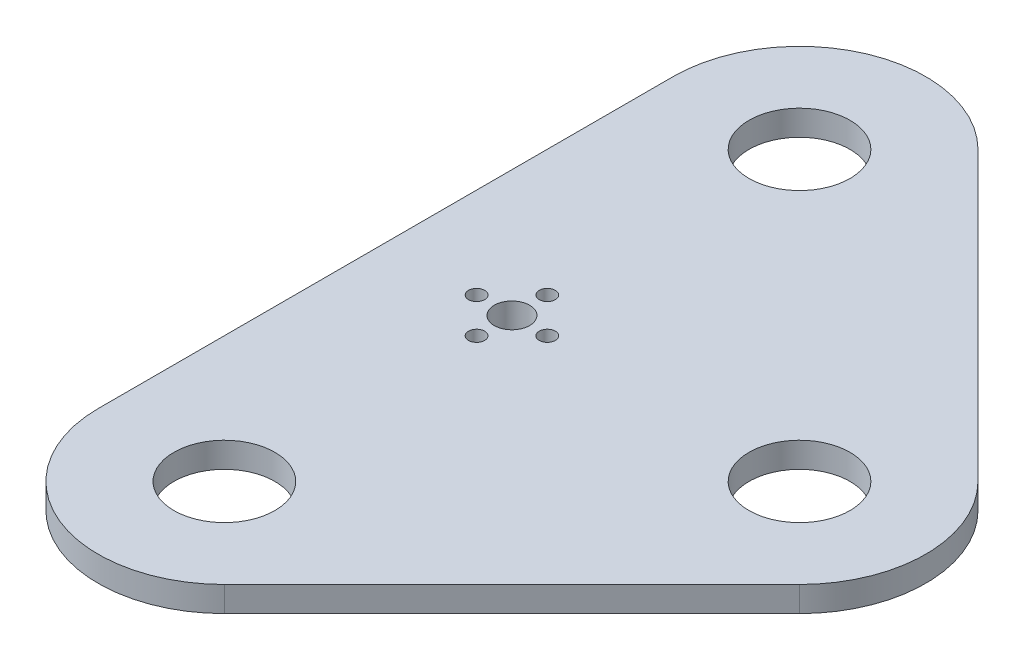
ISO-10303-21;
HEADER;
FILE_DESCRIPTION(('STEP AP214'),'2;1');
FILE_NAME('part.step','',(''),(''),'','','');
FILE_SCHEMA(('AUTOMOTIVE_DESIGN { 1 0 10303 214 1 1 1 1 }'));
ENDSEC;
DATA;
#1=APPLICATION_CONTEXT('core data for automotive mechanical design processes');
#2=APPLICATION_PROTOCOL_DEFINITION('international standard','automotive_design',2000,#1);
#3=PRODUCT_CONTEXT('',#1,'mechanical');
#4=PRODUCT('Part','Part','',(#3));
#5=PRODUCT_RELATED_PRODUCT_CATEGORY('part','',(#4));
#6=PRODUCT_DEFINITION_FORMATION('','',#4);
#7=PRODUCT_DEFINITION_CONTEXT('part definition',#1,'design');
#8=PRODUCT_DEFINITION('design','',#6,#7);
#9=PRODUCT_DEFINITION_SHAPE('','',#8);
#10=(LENGTH_UNIT() NAMED_UNIT(*) SI_UNIT(.MILLI.,.METRE.));
#11=(NAMED_UNIT(*) PLANE_ANGLE_UNIT() SI_UNIT($,.RADIAN.));
#12=(NAMED_UNIT(*) SI_UNIT($,.STERADIAN.) SOLID_ANGLE_UNIT());
#13=UNCERTAINTY_MEASURE_WITH_UNIT(LENGTH_MEASURE(1.E-05),#10,'distance_accuracy_value','');
#14=(GEOMETRIC_REPRESENTATION_CONTEXT(3) GLOBAL_UNCERTAINTY_ASSIGNED_CONTEXT((#13)) GLOBAL_UNIT_ASSIGNED_CONTEXT((#10,
#11,#12)) REPRESENTATION_CONTEXT('',''));
#15=CARTESIAN_POINT('',(0.,0.,0.));
#16=DIRECTION('',(0.,0.,1.));
#17=DIRECTION('',(1.,0.,0.));
#18=AXIS2_PLACEMENT_3D('',#15,#16,#17);
#19=CARTESIAN_POINT('',(-25.,5.,0.));
#20=DIRECTION('',(1.,0.,0.));
#21=DIRECTION('',(0.,0.,-1.));
#22=AXIS2_PLACEMENT_3D('',#19,#20,#21);
#23=PLANE('',#22);
#24=DIRECTION('',(0.,0.,1.));
#25=VECTOR('',#24,1.);
#26=CARTESIAN_POINT('',(-25.,0.,0.));
#27=LINE('',#26,#25);
#28=CARTESIAN_POINT('',(-25.,0.,-56.96));
#29=VERTEX_POINT('',#28);
#30=CARTESIAN_POINT('',(-25.,0.,56.96));
#31=VERTEX_POINT('',#30);
#32=EDGE_CURVE('E151',#29,#31,#27,.T.);
#33=ORIENTED_EDGE('',*,*,#32,.T.);
#34=DIRECTION('',(0.,-1.,0.));
#35=VECTOR('',#34,1.);
#36=CARTESIAN_POINT('',(-25.,5.,56.96));
#37=LINE('',#36,#35);
#38=CARTESIAN_POINT('',(-25.,5.,56.96));
#39=VERTEX_POINT('',#38);
#40=EDGE_CURVE('E11',#39,#31,#37,.T.);
#41=ORIENTED_EDGE('',*,*,#40,.F.);
#42=DIRECTION('',(0.,0.,1.));
#43=VECTOR('',#42,1.);
#44=CARTESIAN_POINT('',(-25.,5.,0.));
#45=LINE('',#44,#43);
#46=CARTESIAN_POINT('',(-25.,5.,-56.96));
#47=VERTEX_POINT('',#46);
#48=EDGE_CURVE('E90',#47,#39,#45,.T.);
#49=ORIENTED_EDGE('',*,*,#48,.F.);
#50=DIRECTION('',(0.,-1.,0.));
#51=VECTOR('',#50,1.);
#52=CARTESIAN_POINT('',(-25.,5.,-56.96));
#53=LINE('',#52,#51);
#54=EDGE_CURVE('E135',#47,#29,#53,.T.);
#55=ORIENTED_EDGE('',*,*,#54,.T.);
#56=EDGE_LOOP('',(#33,#41,#49,#55));
#57=FACE_BOUND('',#56,.T.);
#58=ADVANCED_FACE('F43',(#57),#23,.F.);
#59=CARTESIAN_POINT('',(0.,5.,56.96));
#60=DIRECTION('',(0.,-1.,0.));
#61=DIRECTION('',(0.,0.,-1.));
#62=AXIS2_PLACEMENT_3D('',#59,#60,#61);
#63=CYLINDRICAL_SURFACE('',#62,25.);
#64=CARTESIAN_POINT('',(0.,0.,56.96));
#65=DIRECTION('',(0.,1.,0.));
#66=DIRECTION('',(0.,0.,1.));
#67=AXIS2_PLACEMENT_3D('',#64,#65,#66);
#68=CIRCLE('',#67,25.);
#69=CARTESIAN_POINT('',(17.6776695296637,0.,74.6376695296637));
#70=VERTEX_POINT('',#69);
#71=EDGE_CURVE('E154',#70,#31,#68,.F.);
#72=ORIENTED_EDGE('',*,*,#71,.F.);
#73=DIRECTION('',(0.,-1.,0.));
#74=VECTOR('',#73,1.);
#75=CARTESIAN_POINT('',(17.6776695296637,5.,74.6376695296637));
#76=LINE('',#75,#74);
#77=CARTESIAN_POINT('',(17.6776695296637,5.,74.6376695296637));
#78=VERTEX_POINT('',#77);
#79=EDGE_CURVE('E52',#78,#70,#76,.T.);
#80=ORIENTED_EDGE('',*,*,#79,.F.);
#81=CARTESIAN_POINT('',(0.,5.,56.96));
#82=DIRECTION('',(0.,1.,0.));
#83=DIRECTION('',(0.,0.,1.));
#84=AXIS2_PLACEMENT_3D('',#81,#82,#83);
#85=CIRCLE('',#84,25.);
#86=EDGE_CURVE('E186',#78,#39,#85,.F.);
#87=ORIENTED_EDGE('',*,*,#86,.T.);
#88=ORIENTED_EDGE('',*,*,#40,.T.);
#89=EDGE_LOOP('',(#72,#80,#87,#88));
#90=FACE_BOUND('',#89,.T.);
#91=ADVANCED_FACE('F185',(#90),#63,.T.);
#92=CARTESIAN_POINT('',(46.1576695296637,5.,46.1576695296637));
#93=DIRECTION('',(-0.707106781186548,0.,-0.707106781186548));
#94=DIRECTION('',(-0.707106781186548,0.,0.707106781186548));
#95=AXIS2_PLACEMENT_3D('',#92,#93,#94);
#96=PLANE('',#95);
#97=DIRECTION('',(0.707106781186548,0.,-0.707106781186548));
#98=VECTOR('',#97,1.);
#99=CARTESIAN_POINT('',(46.1576695296637,0.,46.1576695296637));
#100=LINE('',#99,#98);
#101=CARTESIAN_POINT('',(74.6376695296637,0.,17.6776695296637));
#102=VERTEX_POINT('',#101);
#103=EDGE_CURVE('E157',#70,#102,#100,.T.);
#104=ORIENTED_EDGE('',*,*,#103,.T.);
#105=DIRECTION('',(0.,-1.,0.));
#106=VECTOR('',#105,1.);
#107=CARTESIAN_POINT('',(74.6376695296637,5.,17.6776695296637));
#108=LINE('',#107,#106);
#109=CARTESIAN_POINT('',(74.6376695296637,5.,17.6776695296637));
#110=VERTEX_POINT('',#109);
#111=EDGE_CURVE('E119',#110,#102,#108,.T.);
#112=ORIENTED_EDGE('',*,*,#111,.F.);
#113=DIRECTION('',(0.707106781186548,0.,-0.707106781186548));
#114=VECTOR('',#113,1.);
#115=CARTESIAN_POINT('',(46.1576695296637,5.,46.1576695296637));
#116=LINE('',#115,#114);
#117=EDGE_CURVE('E106',#78,#110,#116,.T.);
#118=ORIENTED_EDGE('',*,*,#117,.F.);
#119=ORIENTED_EDGE('',*,*,#79,.T.);
#120=EDGE_LOOP('',(#104,#112,#118,#119));
#121=FACE_BOUND('',#120,.T.);
#122=ADVANCED_FACE('F177',(#121),#96,.F.);
#123=CARTESIAN_POINT('',(56.96,5.,0.));
#124=DIRECTION('',(0.,-1.,0.));
#125=DIRECTION('',(0.,0.,-1.));
#126=AXIS2_PLACEMENT_3D('',#123,#124,#125);
#127=CYLINDRICAL_SURFACE('',#126,25.);
#128=CARTESIAN_POINT('',(56.96,0.,0.));
#129=DIRECTION('',(0.,1.,0.));
#130=DIRECTION('',(0.,0.,1.));
#131=AXIS2_PLACEMENT_3D('',#128,#129,#130);
#132=CIRCLE('',#131,25.);
#133=CARTESIAN_POINT('',(74.6376695296637,0.,-17.6776695296637));
#134=VERTEX_POINT('',#133);
#135=EDGE_CURVE('E115',#102,#134,#132,.T.);
#136=ORIENTED_EDGE('',*,*,#135,.T.);
#137=DIRECTION('',(0.,-1.,0.));
#138=VECTOR('',#137,1.);
#139=CARTESIAN_POINT('',(74.6376695296637,5.,-17.6776695296637));
#140=LINE('',#139,#138);
#141=CARTESIAN_POINT('',(74.6376695296637,5.,-17.6776695296637));
#142=VERTEX_POINT('',#141);
#143=EDGE_CURVE('E112',#142,#134,#140,.T.);
#144=ORIENTED_EDGE('',*,*,#143,.F.);
#145=CARTESIAN_POINT('',(56.96,5.,0.));
#146=DIRECTION('',(0.,1.,0.));
#147=DIRECTION('',(0.,0.,1.));
#148=AXIS2_PLACEMENT_3D('',#145,#146,#147);
#149=CIRCLE('',#148,25.);
#150=EDGE_CURVE('E99',#110,#142,#149,.T.);
#151=ORIENTED_EDGE('',*,*,#150,.F.);
#152=ORIENTED_EDGE('',*,*,#111,.T.);
#153=EDGE_LOOP('',(#136,#144,#151,#152));
#154=FACE_BOUND('',#153,.T.);
#155=ADVANCED_FACE('F113',(#154),#127,.T.);
#156=CARTESIAN_POINT('',(46.1576695296637,5.,-46.1576695296636));
#157=DIRECTION('',(0.707106781186548,0.,-0.707106781186547));
#158=DIRECTION('',(-0.707106781186547,0.,-0.707106781186548));
#159=AXIS2_PLACEMENT_3D('',#156,#157,#158);
#160=PLANE('',#159);
#161=DIRECTION('',(0.707106781186547,0.,0.707106781186548));
#162=VECTOR('',#161,1.);
#163=CARTESIAN_POINT('',(46.1576695296637,0.,-46.1576695296636));
#164=LINE('',#163,#162);
#165=CARTESIAN_POINT('',(17.6776695296637,0.,-74.6376695296637));
#166=VERTEX_POINT('',#165);
#167=EDGE_CURVE('E160',#166,#134,#164,.T.);
#168=ORIENTED_EDGE('',*,*,#167,.F.);
#169=DIRECTION('',(0.,-1.,0.));
#170=VECTOR('',#169,1.);
#171=CARTESIAN_POINT('',(17.6776695296637,5.,-74.6376695296637));
#172=LINE('',#171,#170);
#173=CARTESIAN_POINT('',(17.6776695296637,5.,-74.6376695296637));
#174=VERTEX_POINT('',#173);
#175=EDGE_CURVE('E81',#174,#166,#172,.T.);
#176=ORIENTED_EDGE('',*,*,#175,.F.);
#177=DIRECTION('',(0.707106781186547,0.,0.707106781186548));
#178=VECTOR('',#177,1.);
#179=CARTESIAN_POINT('',(46.1576695296637,5.,-46.1576695296636));
#180=LINE('',#179,#178);
#181=EDGE_CURVE('E104',#174,#142,#180,.T.);
#182=ORIENTED_EDGE('',*,*,#181,.T.);
#183=ORIENTED_EDGE('',*,*,#143,.T.);
#184=EDGE_LOOP('',(#168,#176,#182,#183));
#185=FACE_BOUND('',#184,.T.);
#186=ADVANCED_FACE('F121',(#185),#160,.T.);
#187=CARTESIAN_POINT('',(56.96,5.,0.));
#188=DIRECTION('',(0.,-1.,0.));
#189=DIRECTION('',(0.,0.,-1.));
#190=AXIS2_PLACEMENT_3D('',#187,#188,#189);
#191=CYLINDRICAL_SURFACE('',#190,10.);
#192=CARTESIAN_POINT('',(56.96,5.,0.));
#193=DIRECTION('',(0.,1.,0.));
#194=DIRECTION('',(0.,0.,1.));
#195=AXIS2_PLACEMENT_3D('',#192,#193,#194);
#196=CIRCLE('',#195,10.);
#197=CARTESIAN_POINT('',(56.96,5.,10.));
#198=VERTEX_POINT('',#197);
#199=EDGE_CURVE('E129',#198,#198,#196,.T.);
#200=ORIENTED_EDGE('',*,*,#199,.T.);
#201=EDGE_LOOP('',(#200));
#202=FACE_BOUND('',#201,.T.);
#203=CARTESIAN_POINT('',(56.96,0.,0.));
#204=DIRECTION('',(0.,1.,0.));
#205=DIRECTION('',(0.,0.,1.));
#206=AXIS2_PLACEMENT_3D('',#203,#204,#205);
#207=CIRCLE('',#206,10.);
#208=CARTESIAN_POINT('',(56.96,0.,10.));
#209=VERTEX_POINT('',#208);
#210=EDGE_CURVE('E166',#209,#209,#207,.T.);
#211=ORIENTED_EDGE('',*,*,#210,.F.);
#212=EDGE_LOOP('',(#211));
#213=FACE_BOUND('',#212,.T.);
#214=ADVANCED_FACE('F200',(#202,#213),#191,.F.);
#215=CARTESIAN_POINT('',(0.,5.,-56.96));
#216=DIRECTION('',(0.,-1.,0.));
#217=DIRECTION('',(0.,0.,-1.));
#218=AXIS2_PLACEMENT_3D('',#215,#216,#217);
#219=CYLINDRICAL_SURFACE('',#218,10.);
#220=CARTESIAN_POINT('',(0.,5.,-56.96));
#221=DIRECTION('',(0.,1.,0.));
#222=DIRECTION('',(0.,0.,1.));
#223=AXIS2_PLACEMENT_3D('',#220,#221,#222);
#224=CIRCLE('',#223,10.);
#225=CARTESIAN_POINT('',(0.,5.,-46.96));
#226=VERTEX_POINT('',#225);
#227=EDGE_CURVE('E123',#226,#226,#224,.T.);
#228=ORIENTED_EDGE('',*,*,#227,.T.);
#229=EDGE_LOOP('',(#228));
#230=FACE_BOUND('',#229,.T.);
#231=CARTESIAN_POINT('',(0.,0.,-56.96));
#232=DIRECTION('',(0.,1.,0.));
#233=DIRECTION('',(0.,0.,1.));
#234=AXIS2_PLACEMENT_3D('',#231,#232,#233);
#235=CIRCLE('',#234,10.);
#236=CARTESIAN_POINT('',(0.,0.,-46.96));
#237=VERTEX_POINT('',#236);
#238=EDGE_CURVE('E163',#237,#237,#235,.T.);
#239=ORIENTED_EDGE('',*,*,#238,.F.);
#240=EDGE_LOOP('',(#239));
#241=FACE_BOUND('',#240,.T.);
#242=ADVANCED_FACE('F191',(#230,#241),#219,.F.);
#243=CARTESIAN_POINT('',(0.,5.,-56.96));
#244=DIRECTION('',(0.,-1.,0.));
#245=DIRECTION('',(0.,0.,-1.));
#246=AXIS2_PLACEMENT_3D('',#243,#244,#245);
#247=CYLINDRICAL_SURFACE('',#246,25.);
#248=CARTESIAN_POINT('',(0.,0.,-56.96));
#249=DIRECTION('',(0.,1.,0.));
#250=DIRECTION('',(0.,0.,1.));
#251=AXIS2_PLACEMENT_3D('',#248,#249,#250);
#252=CIRCLE('',#251,25.);
#253=EDGE_CURVE('E84',#166,#29,#252,.T.);
#254=ORIENTED_EDGE('',*,*,#253,.T.);
#255=ORIENTED_EDGE('',*,*,#54,.F.);
#256=CARTESIAN_POINT('',(0.,5.,-56.96));
#257=DIRECTION('',(0.,1.,0.));
#258=DIRECTION('',(0.,0.,1.));
#259=AXIS2_PLACEMENT_3D('',#256,#257,#258);
#260=CIRCLE('',#259,25.);
#261=EDGE_CURVE('E60',#174,#47,#260,.T.);
#262=ORIENTED_EDGE('',*,*,#261,.F.);
#263=ORIENTED_EDGE('',*,*,#175,.T.);
#264=EDGE_LOOP('',(#254,#255,#262,#263));
#265=FACE_BOUND('',#264,.T.);
#266=ADVANCED_FACE('F188',(#265),#247,.T.);
#267=CARTESIAN_POINT('',(0.,5.,7.));
#268=DIRECTION('',(0.,-1.,0.));
#269=DIRECTION('',(0.,0.,-1.));
#270=AXIS2_PLACEMENT_3D('',#267,#268,#269);
#271=CYLINDRICAL_SURFACE('',#270,1.6);
#272=CARTESIAN_POINT('',(0.,5.,7.));
#273=DIRECTION('',(0.,1.,0.));
#274=DIRECTION('',(0.,0.,1.));
#275=AXIS2_PLACEMENT_3D('',#272,#273,#274);
#276=CIRCLE('',#275,1.6);
#277=CARTESIAN_POINT('',(0.,5.,8.6));
#278=VERTEX_POINT('',#277);
#279=EDGE_CURVE('E391',#278,#278,#276,.F.);
#280=ORIENTED_EDGE('',*,*,#279,.F.);
#281=EDGE_LOOP('',(#280));
#282=FACE_BOUND('',#281,.T.);
#283=CARTESIAN_POINT('',(0.,0.,7.));
#284=DIRECTION('',(0.,1.,0.));
#285=DIRECTION('',(0.,0.,1.));
#286=AXIS2_PLACEMENT_3D('',#283,#284,#285);
#287=CIRCLE('',#286,1.6);
#288=CARTESIAN_POINT('',(0.,0.,8.6));
#289=VERTEX_POINT('',#288);
#290=EDGE_CURVE('E148',#289,#289,#287,.F.);
#291=ORIENTED_EDGE('',*,*,#290,.T.);
#292=EDGE_LOOP('',(#291));
#293=FACE_BOUND('',#292,.T.);
#294=ADVANCED_FACE('F190',(#282,#293),#271,.F.);
#295=CARTESIAN_POINT('',(0.,5.,0.));
#296=DIRECTION('',(0.,-1.,0.));
#297=DIRECTION('',(0.,0.,-1.));
#298=AXIS2_PLACEMENT_3D('',#295,#296,#297);
#299=CYLINDRICAL_SURFACE('',#298,3.5);
#300=CARTESIAN_POINT('',(0.,5.,0.));
#301=DIRECTION('',(0.,1.,0.));
#302=DIRECTION('',(0.,0.,1.));
#303=AXIS2_PLACEMENT_3D('',#300,#301,#302);
#304=CIRCLE('',#303,3.5);
#305=CARTESIAN_POINT('',(0.,5.,3.5));
#306=VERTEX_POINT('',#305);
#307=EDGE_CURVE('E388',#306,#306,#304,.T.);
#308=ORIENTED_EDGE('',*,*,#307,.T.);
#309=EDGE_LOOP('',(#308));
#310=FACE_BOUND('',#309,.T.);
#311=CARTESIAN_POINT('',(0.,0.,0.));
#312=DIRECTION('',(0.,1.,0.));
#313=DIRECTION('',(0.,0.,1.));
#314=AXIS2_PLACEMENT_3D('',#311,#312,#313);
#315=CIRCLE('',#314,3.5);
#316=CARTESIAN_POINT('',(0.,0.,3.5));
#317=VERTEX_POINT('',#316);
#318=EDGE_CURVE('E145',#317,#317,#315,.T.);
#319=ORIENTED_EDGE('',*,*,#318,.F.);
#320=EDGE_LOOP('',(#319));
#321=FACE_BOUND('',#320,.T.);
#322=ADVANCED_FACE('F197',(#310,#321),#299,.F.);
#323=CARTESIAN_POINT('',(0.,5.,-7.));
#324=DIRECTION('',(0.,-1.,0.));
#325=DIRECTION('',(0.,0.,-1.));
#326=AXIS2_PLACEMENT_3D('',#323,#324,#325);
#327=CYLINDRICAL_SURFACE('',#326,1.6);
#328=CARTESIAN_POINT('',(0.,5.,-7.));
#329=DIRECTION('',(0.,1.,0.));
#330=DIRECTION('',(0.,0.,1.));
#331=AXIS2_PLACEMENT_3D('',#328,#329,#330);
#332=CIRCLE('',#331,1.6);
#333=CARTESIAN_POINT('',(0.,5.,-5.4));
#334=VERTEX_POINT('',#333);
#335=EDGE_CURVE('E384',#334,#334,#332,.T.);
#336=ORIENTED_EDGE('',*,*,#335,.T.);
#337=EDGE_LOOP('',(#336));
#338=FACE_BOUND('',#337,.T.);
#339=CARTESIAN_POINT('',(0.,0.,-7.));
#340=DIRECTION('',(0.,1.,0.));
#341=DIRECTION('',(0.,0.,1.));
#342=AXIS2_PLACEMENT_3D('',#339,#340,#341);
#343=CIRCLE('',#342,1.6);
#344=CARTESIAN_POINT('',(0.,0.,-5.4));
#345=VERTEX_POINT('',#344);
#346=EDGE_CURVE('E142',#345,#345,#343,.T.);
#347=ORIENTED_EDGE('',*,*,#346,.F.);
#348=EDGE_LOOP('',(#347));
#349=FACE_BOUND('',#348,.T.);
#350=ADVANCED_FACE('F214',(#338,#349),#327,.F.);
#351=CARTESIAN_POINT('',(7.,5.,0.));
#352=DIRECTION('',(0.,-1.,0.));
#353=DIRECTION('',(0.,0.,-1.));
#354=AXIS2_PLACEMENT_3D('',#351,#352,#353);
#355=CYLINDRICAL_SURFACE('',#354,1.6);
#356=CARTESIAN_POINT('',(7.,5.,0.));
#357=DIRECTION('',(0.,1.,0.));
#358=DIRECTION('',(0.,0.,1.));
#359=AXIS2_PLACEMENT_3D('',#356,#357,#358);
#360=CIRCLE('',#359,1.6);
#361=CARTESIAN_POINT('',(7.,5.,1.6));
#362=VERTEX_POINT('',#361);
#363=EDGE_CURVE('E229',#362,#362,#360,.T.);
#364=ORIENTED_EDGE('',*,*,#363,.T.);
#365=EDGE_LOOP('',(#364));
#366=FACE_BOUND('',#365,.T.);
#367=CARTESIAN_POINT('',(7.,0.,0.));
#368=DIRECTION('',(0.,1.,0.));
#369=DIRECTION('',(0.,0.,1.));
#370=AXIS2_PLACEMENT_3D('',#367,#368,#369);
#371=CIRCLE('',#370,1.6);
#372=CARTESIAN_POINT('',(7.,0.,1.6));
#373=VERTEX_POINT('',#372);
#374=EDGE_CURVE('E139',#373,#373,#371,.T.);
#375=ORIENTED_EDGE('',*,*,#374,.F.);
#376=EDGE_LOOP('',(#375));
#377=FACE_BOUND('',#376,.T.);
#378=ADVANCED_FACE('F217',(#366,#377),#355,.F.);
#379=CARTESIAN_POINT('',(-7.,5.,0.));
#380=DIRECTION('',(0.,-1.,0.));
#381=DIRECTION('',(0.,0.,-1.));
#382=AXIS2_PLACEMENT_3D('',#379,#380,#381);
#383=CYLINDRICAL_SURFACE('',#382,1.6);
#384=CARTESIAN_POINT('',(-7.,5.,0.));
#385=DIRECTION('',(0.,1.,0.));
#386=DIRECTION('',(0.,0.,1.));
#387=AXIS2_PLACEMENT_3D('',#384,#385,#386);
#388=CIRCLE('',#387,1.6);
#389=CARTESIAN_POINT('',(-7.,5.,1.6));
#390=VERTEX_POINT('',#389);
#391=EDGE_CURVE('E172',#390,#390,#388,.F.);
#392=ORIENTED_EDGE('',*,*,#391,.F.);
#393=EDGE_LOOP('',(#392));
#394=FACE_BOUND('',#393,.T.);
#395=CARTESIAN_POINT('',(-7.,0.,0.));
#396=DIRECTION('',(0.,1.,0.));
#397=DIRECTION('',(0.,0.,1.));
#398=AXIS2_PLACEMENT_3D('',#395,#396,#397);
#399=CIRCLE('',#398,1.6);
#400=CARTESIAN_POINT('',(-7.,0.,1.6));
#401=VERTEX_POINT('',#400);
#402=EDGE_CURVE('E136',#401,#401,#399,.F.);
#403=ORIENTED_EDGE('',*,*,#402,.T.);
#404=EDGE_LOOP('',(#403));
#405=FACE_BOUND('',#404,.T.);
#406=ADVANCED_FACE('F45',(#394,#405),#383,.F.);
#407=CARTESIAN_POINT('',(0.,5.,56.96));
#408=DIRECTION('',(0.,-1.,0.));
#409=DIRECTION('',(0.,0.,-1.));
#410=AXIS2_PLACEMENT_3D('',#407,#408,#409);
#411=CYLINDRICAL_SURFACE('',#410,10.);
#412=CARTESIAN_POINT('',(0.,5.,56.96));
#413=DIRECTION('',(0.,1.,0.));
#414=DIRECTION('',(0.,0.,1.));
#415=AXIS2_PLACEMENT_3D('',#412,#413,#414);
#416=CIRCLE('',#415,10.);
#417=CARTESIAN_POINT('',(0.,5.,66.96));
#418=VERTEX_POINT('',#417);
#419=EDGE_CURVE('E132',#418,#418,#416,.T.);
#420=ORIENTED_EDGE('',*,*,#419,.T.);
#421=EDGE_LOOP('',(#420));
#422=FACE_BOUND('',#421,.T.);
#423=CARTESIAN_POINT('',(0.,0.,56.96));
#424=DIRECTION('',(0.,1.,0.));
#425=DIRECTION('',(0.,0.,1.));
#426=AXIS2_PLACEMENT_3D('',#423,#424,#425);
#427=CIRCLE('',#426,10.);
#428=CARTESIAN_POINT('',(0.,0.,66.96));
#429=VERTEX_POINT('',#428);
#430=EDGE_CURVE('E169',#429,#429,#427,.T.);
#431=ORIENTED_EDGE('',*,*,#430,.F.);
#432=EDGE_LOOP('',(#431));
#433=FACE_BOUND('',#432,.T.);
#434=ADVANCED_FACE('F224',(#422,#433),#411,.F.);
#435=CARTESIAN_POINT('',(0.,5.,0.));
#436=DIRECTION('',(0.,1.,0.));
#437=DIRECTION('',(0.,0.,1.));
#438=AXIS2_PLACEMENT_3D('',#435,#436,#437);
#439=PLANE('',#438);
#440=ORIENTED_EDGE('',*,*,#391,.T.);
#441=EDGE_LOOP('',(#440));
#442=FACE_BOUND('',#441,.T.);
#443=ORIENTED_EDGE('',*,*,#363,.F.);
#444=EDGE_LOOP('',(#443));
#445=FACE_BOUND('',#444,.T.);
#446=ORIENTED_EDGE('',*,*,#335,.F.);
#447=EDGE_LOOP('',(#446));
#448=FACE_BOUND('',#447,.T.);
#449=ORIENTED_EDGE('',*,*,#307,.F.);
#450=EDGE_LOOP('',(#449));
#451=FACE_BOUND('',#450,.T.);
#452=ORIENTED_EDGE('',*,*,#279,.T.);
#453=EDGE_LOOP('',(#452));
#454=FACE_BOUND('',#453,.T.);
#455=ORIENTED_EDGE('',*,*,#48,.T.);
#456=ORIENTED_EDGE('',*,*,#86,.F.);
#457=ORIENTED_EDGE('',*,*,#117,.T.);
#458=ORIENTED_EDGE('',*,*,#150,.T.);
#459=ORIENTED_EDGE('',*,*,#181,.F.);
#460=ORIENTED_EDGE('',*,*,#261,.T.);
#461=EDGE_LOOP('',(#455,#456,#457,#458,#459,#460));
#462=FACE_BOUND('',#461,.T.);
#463=ORIENTED_EDGE('',*,*,#227,.F.);
#464=EDGE_LOOP('',(#463));
#465=FACE_BOUND('',#464,.T.);
#466=ORIENTED_EDGE('',*,*,#199,.F.);
#467=EDGE_LOOP('',(#466));
#468=FACE_BOUND('',#467,.T.);
#469=ORIENTED_EDGE('',*,*,#419,.F.);
#470=EDGE_LOOP('',(#469));
#471=FACE_BOUND('',#470,.T.);
#472=ADVANCED_FACE('F101',(#442,#445,#448,#451,#454,#462,#465,#468,#471),#439,.T.);
#473=CARTESIAN_POINT('',(0.,0.,0.));
#474=DIRECTION('',(0.,1.,0.));
#475=DIRECTION('',(0.,0.,1.));
#476=AXIS2_PLACEMENT_3D('',#473,#474,#475);
#477=PLANE('',#476);
#478=ORIENTED_EDGE('',*,*,#402,.F.);
#479=EDGE_LOOP('',(#478));
#480=FACE_BOUND('',#479,.T.);
#481=ORIENTED_EDGE('',*,*,#374,.T.);
#482=EDGE_LOOP('',(#481));
#483=FACE_BOUND('',#482,.T.);
#484=ORIENTED_EDGE('',*,*,#346,.T.);
#485=EDGE_LOOP('',(#484));
#486=FACE_BOUND('',#485,.T.);
#487=ORIENTED_EDGE('',*,*,#318,.T.);
#488=EDGE_LOOP('',(#487));
#489=FACE_BOUND('',#488,.T.);
#490=ORIENTED_EDGE('',*,*,#290,.F.);
#491=EDGE_LOOP('',(#490));
#492=FACE_BOUND('',#491,.T.);
#493=ORIENTED_EDGE('',*,*,#32,.F.);
#494=ORIENTED_EDGE('',*,*,#253,.F.);
#495=ORIENTED_EDGE('',*,*,#167,.T.);
#496=ORIENTED_EDGE('',*,*,#135,.F.);
#497=ORIENTED_EDGE('',*,*,#103,.F.);
#498=ORIENTED_EDGE('',*,*,#71,.T.);
#499=EDGE_LOOP('',(#493,#494,#495,#496,#497,#498));
#500=FACE_BOUND('',#499,.T.);
#501=ORIENTED_EDGE('',*,*,#238,.T.);
#502=EDGE_LOOP('',(#501));
#503=FACE_BOUND('',#502,.T.);
#504=ORIENTED_EDGE('',*,*,#210,.T.);
#505=EDGE_LOOP('',(#504));
#506=FACE_BOUND('',#505,.T.);
#507=ORIENTED_EDGE('',*,*,#430,.T.);
#508=EDGE_LOOP('',(#507));
#509=FACE_BOUND('',#508,.T.);
#510=ADVANCED_FACE('F183',(#480,#483,#486,#489,#492,#500,#503,#506,#509),#477,.F.);
#511=CLOSED_SHELL('',(#58,#91,#122,#155,#186,#214,#242,#266,#294,#322,#350,#378,#406,#434,#472,#510));
#512=MANIFOLD_SOLID_BREP('B2',#511);
#513=ADVANCED_BREP_SHAPE_REPRESENTATION('',(#18,#512),#14);
#514=SHAPE_DEFINITION_REPRESENTATION(#9,#513);
ENDSEC;
END-ISO-10303-21;
